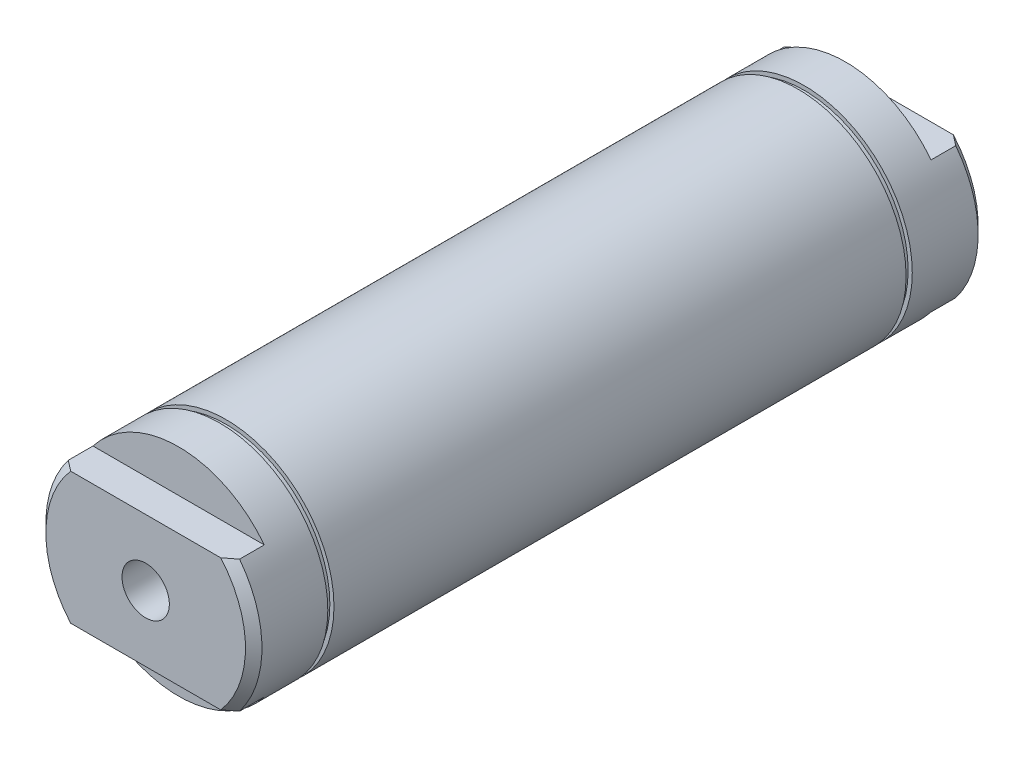
ISO-10303-21;
HEADER;
FILE_DESCRIPTION(('STEP AP214'),'2;1');
FILE_NAME('part.step','',(''),(''),'','','');
FILE_SCHEMA(('AUTOMOTIVE_DESIGN { 1 0 10303 214 1 1 1 1 }'));
ENDSEC;
DATA;
#1=APPLICATION_CONTEXT('core data for automotive mechanical design processes');
#2=APPLICATION_PROTOCOL_DEFINITION('international standard','automotive_design',2000,#1);
#3=PRODUCT_CONTEXT('',#1,'mechanical');
#4=PRODUCT('Part','Part','',(#3));
#5=PRODUCT_RELATED_PRODUCT_CATEGORY('part','',(#4));
#6=PRODUCT_DEFINITION_FORMATION('','',#4);
#7=PRODUCT_DEFINITION_CONTEXT('part definition',#1,'design');
#8=PRODUCT_DEFINITION('design','',#6,#7);
#9=PRODUCT_DEFINITION_SHAPE('','',#8);
#10=(LENGTH_UNIT() NAMED_UNIT(*) SI_UNIT(.MILLI.,.METRE.));
#11=(NAMED_UNIT(*) PLANE_ANGLE_UNIT() SI_UNIT($,.RADIAN.));
#12=(NAMED_UNIT(*) SI_UNIT($,.STERADIAN.) SOLID_ANGLE_UNIT());
#13=UNCERTAINTY_MEASURE_WITH_UNIT(LENGTH_MEASURE(1.E-05),#10,'distance_accuracy_value','');
#14=(GEOMETRIC_REPRESENTATION_CONTEXT(3) GLOBAL_UNCERTAINTY_ASSIGNED_CONTEXT((#13)) GLOBAL_UNIT_ASSIGNED_CONTEXT((#10,
#11,#12)) REPRESENTATION_CONTEXT('',''));
#15=CARTESIAN_POINT('',(0.,0.,0.));
#16=DIRECTION('',(0.,0.,1.));
#17=DIRECTION('',(1.,0.,0.));
#18=AXIS2_PLACEMENT_3D('',#15,#16,#17);
#19=CARTESIAN_POINT('',(0.,0.,89.));
#20=DIRECTION('',(0.,0.,-1.));
#21=DIRECTION('',(-1.,0.,0.));
#22=AXIS2_PLACEMENT_3D('',#19,#20,#21);
#23=CYLINDRICAL_SURFACE('',#22,26.25);
#24=CARTESIAN_POINT('',(0.,0.,69.5));
#25=DIRECTION('',(0.,0.,1.));
#26=DIRECTION('',(1.,0.,0.));
#27=AXIS2_PLACEMENT_3D('',#24,#25,#26);
#28=CIRCLE('',#27,26.25);
#29=CARTESIAN_POINT('',(26.25,0.,69.5));
#30=VERTEX_POINT('',#29);
#31=EDGE_CURVE('E464',#30,#30,#28,.T.);
#32=ORIENTED_EDGE('',*,*,#31,.F.);
#33=EDGE_LOOP('',(#32));
#34=FACE_BOUND('',#33,.T.);
#35=CARTESIAN_POINT('',(0.,0.,-69.5));
#36=DIRECTION('',(0.,0.,1.));
#37=DIRECTION('',(1.,0.,0.));
#38=AXIS2_PLACEMENT_3D('',#35,#36,#37);
#39=CIRCLE('',#38,26.25);
#40=CARTESIAN_POINT('',(26.25,0.,-69.5));
#41=VERTEX_POINT('',#40);
#42=EDGE_CURVE('E166',#41,#41,#39,.T.);
#43=ORIENTED_EDGE('',*,*,#42,.T.);
#44=EDGE_LOOP('',(#43));
#45=FACE_BOUND('',#44,.T.);
#46=ADVANCED_FACE('F51',(#34,#45),#23,.T.);
#47=CARTESIAN_POINT('',(26.25,0.,-69.5));
#48=DIRECTION('',(0.,0.,1.));
#49=DIRECTION('',(1.,0.,0.));
#50=AXIS2_PLACEMENT_3D('',#47,#48,#49);
#51=PLANE('',#50);
#52=ORIENTED_EDGE('',*,*,#42,.F.);
#53=EDGE_LOOP('',(#52));
#54=FACE_BOUND('',#53,.T.);
#55=CARTESIAN_POINT('',(0.,0.,-69.5));
#56=DIRECTION('',(0.,0.,1.));
#57=DIRECTION('',(1.,0.,0.));
#58=AXIS2_PLACEMENT_3D('',#55,#56,#57);
#59=CIRCLE('',#58,25.25);
#60=CARTESIAN_POINT('',(25.25,0.,-69.5));
#61=VERTEX_POINT('',#60);
#62=EDGE_CURVE('E473',#61,#61,#59,.T.);
#63=ORIENTED_EDGE('',*,*,#62,.T.);
#64=EDGE_LOOP('',(#63));
#65=FACE_BOUND('',#64,.T.);
#66=ADVANCED_FACE('F344',(#54,#65),#51,.F.);
#67=CARTESIAN_POINT('',(0.,0.,89.));
#68=DIRECTION('',(0.,0.,1.));
#69=DIRECTION('',(1.,0.,0.));
#70=AXIS2_PLACEMENT_3D('',#67,#68,#69);
#71=CYLINDRICAL_SURFACE('',#70,25.25);
#72=ORIENTED_EDGE('',*,*,#62,.F.);
#73=EDGE_LOOP('',(#72));
#74=FACE_BOUND('',#73,.T.);
#75=CARTESIAN_POINT('',(0.,0.,-71.));
#76=DIRECTION('',(0.,0.,1.));
#77=DIRECTION('',(1.,0.,0.));
#78=AXIS2_PLACEMENT_3D('',#75,#76,#77);
#79=CIRCLE('',#78,25.25);
#80=CARTESIAN_POINT('',(25.25,0.,-71.));
#81=VERTEX_POINT('',#80);
#82=EDGE_CURVE('E470',#81,#81,#79,.T.);
#83=ORIENTED_EDGE('',*,*,#82,.T.);
#84=EDGE_LOOP('',(#83));
#85=FACE_BOUND('',#84,.T.);
#86=ADVANCED_FACE('F350',(#74,#85),#71,.T.);
#87=CARTESIAN_POINT('',(26.25,0.,-71.));
#88=DIRECTION('',(0.,0.,-1.));
#89=DIRECTION('',(-1.,0.,0.));
#90=AXIS2_PLACEMENT_3D('',#87,#88,#89);
#91=PLANE('',#90);
#92=ORIENTED_EDGE('',*,*,#82,.F.);
#93=EDGE_LOOP('',(#92));
#94=FACE_BOUND('',#93,.T.);
#95=CARTESIAN_POINT('',(0.,0.,-71.));
#96=DIRECTION('',(0.,0.,1.));
#97=DIRECTION('',(1.,0.,0.));
#98=AXIS2_PLACEMENT_3D('',#95,#96,#97);
#99=CIRCLE('',#98,26.25);
#100=CARTESIAN_POINT('',(26.25,0.,-71.));
#101=VERTEX_POINT('',#100);
#102=EDGE_CURVE('E467',#101,#101,#99,.T.);
#103=ORIENTED_EDGE('',*,*,#102,.T.);
#104=EDGE_LOOP('',(#103));
#105=FACE_BOUND('',#104,.T.);
#106=ADVANCED_FACE('F154',(#94,#105),#91,.F.);
#107=CARTESIAN_POINT('',(0.,0.,-79.));
#108=DIRECTION('',(0.,0.,-1.));
#109=DIRECTION('',(-1.,0.,0.));
#110=AXIS2_PLACEMENT_3D('',#107,#108,#109);
#111=CONICAL_SURFACE('',#110,5.75437,1.02974425867665);
#112=CARTESIAN_POINT('',(0.,0.,-75.5424256796864));
#113=VERTEX_POINT('',#112);
#114=VERTEX_LOOP('',#113);
#115=FACE_BOUND('',#114,.T.);
#116=CARTESIAN_POINT('',(0.,0.,-79.));
#117=DIRECTION('',(0.,0.,-1.));
#118=DIRECTION('',(-1.,0.,0.));
#119=AXIS2_PLACEMENT_3D('',#116,#117,#118);
#120=CIRCLE('',#119,5.75437);
#121=CARTESIAN_POINT('',(-5.75437,0.,-79.));
#122=VERTEX_POINT('',#121);
#123=EDGE_CURVE('E158',#122,#122,#120,.T.);
#124=ORIENTED_EDGE('',*,*,#123,.T.);
#125=EDGE_LOOP('',(#124));
#126=FACE_BOUND('',#125,.T.);
#127=ADVANCED_FACE('F150',(#115,#126),#111,.F.);
#128=CARTESIAN_POINT('',(0.,0.,-89.));
#129=DIRECTION('',(0.,0.,-1.));
#130=DIRECTION('',(-1.,0.,0.));
#131=AXIS2_PLACEMENT_3D('',#128,#129,#130);
#132=CYLINDRICAL_SURFACE('',#131,5.75436999999999);
#133=ORIENTED_EDGE('',*,*,#123,.F.);
#134=EDGE_LOOP('',(#133));
#135=FACE_BOUND('',#134,.T.);
#136=CARTESIAN_POINT('',(0.,0.,-89.));
#137=DIRECTION('',(0.,0.,-1.));
#138=DIRECTION('',(-1.,0.,0.));
#139=AXIS2_PLACEMENT_3D('',#136,#137,#138);
#140=CIRCLE('',#139,5.75436999999999);
#141=CARTESIAN_POINT('',(-5.75436999999999,0.,-89.));
#142=VERTEX_POINT('',#141);
#143=EDGE_CURVE('E161',#142,#142,#140,.T.);
#144=ORIENTED_EDGE('',*,*,#143,.T.);
#145=EDGE_LOOP('',(#144));
#146=FACE_BOUND('',#145,.T.);
#147=ADVANCED_FACE('F153',(#135,#146),#132,.F.);
#148=CARTESIAN_POINT('',(0.,0.,-81.));
#149=DIRECTION('',(0.,0.,-1.));
#150=DIRECTION('',(1.,0.,0.));
#151=AXIS2_PLACEMENT_3D('',#148,#149,#150);
#152=PLANE('',#151);
#153=CARTESIAN_POINT('',(0.,0.,-81.));
#154=DIRECTION('',(0.,0.,1.));
#155=DIRECTION('',(1.,0.,0.));
#156=AXIS2_PLACEMENT_3D('',#153,#154,#155);
#157=CIRCLE('',#156,26.25);
#158=CARTESIAN_POINT('',(-20.8101537716568,-16.,-81.));
#159=VERTEX_POINT('',#158);
#160=CARTESIAN_POINT('',(20.8101537716568,-16.,-81.));
#161=VERTEX_POINT('',#160);
#162=EDGE_CURVE('E163',#159,#161,#157,.T.);
#163=ORIENTED_EDGE('',*,*,#162,.F.);
#164=DIRECTION('',(-1.,0.,0.));
#165=VECTOR('',#164,1.);
#166=CARTESIAN_POINT('',(20.8101537716568,-16.,-81.));
#167=LINE('',#166,#165);
#168=EDGE_CURVE('E186',#161,#159,#167,.T.);
#169=ORIENTED_EDGE('',*,*,#168,.F.);
#170=EDGE_LOOP('',(#163,#169));
#171=FACE_BOUND('',#170,.T.);
#172=ADVANCED_FACE('F327',(#171),#152,.T.);
#173=CARTESIAN_POINT('',(20.8101537716568,-16.,-81.));
#174=DIRECTION('',(0.,-1.,0.));
#175=DIRECTION('',(0.,0.,-1.));
#176=AXIS2_PLACEMENT_3D('',#173,#174,#175);
#177=PLANE('',#176);
#178=DIRECTION('',(0.,0.,-1.));
#179=VECTOR('',#178,1.);
#180=CARTESIAN_POINT('',(-20.8101537716568,-16.,-81.));
#181=LINE('',#180,#179);
#182=CARTESIAN_POINT('',(-20.8101537716568,-16.,-87.));
#183=VERTEX_POINT('',#182);
#184=EDGE_CURVE('E187',#159,#183,#181,.T.);
#185=ORIENTED_EDGE('',*,*,#184,.T.);
#186=CARTESIAN_POINT('',(-20.8101537716568,-16.,-87.));
#187=CARTESIAN_POINT('',(-20.5965788943011,-16.,-87.1693129712668));
#188=CARTESIAN_POINT('',(-20.382534274038,-16.,-87.3380345634438));
#189=CARTESIAN_POINT('',(-19.9534476279904,-16.,-87.6741859546091));
#190=CARTESIAN_POINT('',(-19.7384056441946,-16.,-87.841615807203));
#191=CARTESIAN_POINT('',(-19.3072474935535,-16.,-88.1750896395162));
#192=CARTESIAN_POINT('',(-19.091131321499,-16.,-88.3411336125043));
#193=CARTESIAN_POINT('',(-18.657741488002,-16.,-88.6717226189774));
#194=CARTESIAN_POINT('',(-18.440467778629,-16.,-88.836267589616));
#195=CARTESIAN_POINT('',(-18.2225821441419,-16.,-89.));
#196=B_SPLINE_CURVE_WITH_KNOTS('',3,(#186,#187,#188,#189,#190,#191,#192,#193,#194,#195),
.UNSPECIFIED.,.F.,.F.,(4,2,2,2,4),(0.,0.817636826733301,1.6352395381552,2.45284621838857,
3.27048702084017),.UNSPECIFIED.);
#197=CARTESIAN_POINT('',(-18.2225821441419,-16.,-89.));
#198=VERTEX_POINT('',#197);
#199=EDGE_CURVE('E317',#183,#198,#196,.T.);
#200=ORIENTED_EDGE('',*,*,#199,.T.);
#201=DIRECTION('',(-1.,0.,0.));
#202=VECTOR('',#201,1.);
#203=CARTESIAN_POINT('',(20.8101537716568,-16.,-89.));
#204=LINE('',#203,#202);
#205=CARTESIAN_POINT('',(18.2225821441419,-16.,-89.));
#206=VERTEX_POINT('',#205);
#207=EDGE_CURVE('E160',#206,#198,#204,.T.);
#208=ORIENTED_EDGE('',*,*,#207,.F.);
#209=CARTESIAN_POINT('',(18.2225821441419,-16.,-89.));
#210=CARTESIAN_POINT('',(18.440467778629,-16.,-88.836267589616));
#211=CARTESIAN_POINT('',(18.657741488002,-16.,-88.6717226189774));
#212=CARTESIAN_POINT('',(19.091131321499,-16.,-88.3411336125043));
#213=CARTESIAN_POINT('',(19.3072474935535,-16.,-88.1750896395162));
#214=CARTESIAN_POINT('',(19.7384056441946,-16.,-87.841615807203));
#215=CARTESIAN_POINT('',(19.9534476279904,-16.,-87.6741859546091));
#216=CARTESIAN_POINT('',(20.382534274038,-16.,-87.3380345634438));
#217=CARTESIAN_POINT('',(20.5965788943011,-16.,-87.1693129712668));
#218=CARTESIAN_POINT('',(20.8101537716568,-16.,-87.));
#219=B_SPLINE_CURVE_WITH_KNOTS('',3,(#209,#210,#211,#212,#213,#214,#215,#216,#217,#218),
.UNSPECIFIED.,.F.,.F.,(4,2,2,2,4),(0.,0.817640802451616,1.63524748268497,2.45285019410687,
3.27048702084017),.UNSPECIFIED.);
#220=CARTESIAN_POINT('',(20.8101537716568,-16.,-87.));
#221=VERTEX_POINT('',#220);
#222=EDGE_CURVE('E310',#206,#221,#219,.T.);
#223=ORIENTED_EDGE('',*,*,#222,.T.);
#224=DIRECTION('',(0.,0.,-1.));
#225=VECTOR('',#224,1.);
#226=CARTESIAN_POINT('',(20.8101537716568,-16.,-81.));
#227=LINE('',#226,#225);
#228=EDGE_CURVE('E178',#161,#221,#227,.T.);
#229=ORIENTED_EDGE('',*,*,#228,.F.);
#230=ORIENTED_EDGE('',*,*,#168,.T.);
#231=EDGE_LOOP('',(#185,#200,#208,#223,#229,#230));
#232=FACE_BOUND('',#231,.T.);
#233=ADVANCED_FACE('F275',(#232),#177,.T.);
#234=CARTESIAN_POINT('',(0.,0.,-89.));
#235=DIRECTION('',(0.,0.,1.));
#236=DIRECTION('',(1.,0.,0.));
#237=AXIS2_PLACEMENT_3D('',#234,#235,#236);
#238=PLANE('',#237);
#239=ORIENTED_EDGE('',*,*,#143,.F.);
#240=EDGE_LOOP('',(#239));
#241=FACE_BOUND('',#240,.T.);
#242=ORIENTED_EDGE('',*,*,#207,.T.);
#243=CARTESIAN_POINT('',(0.,0.,-89.));
#244=DIRECTION('',(0.,0.,1.));
#245=DIRECTION('',(1.,0.,0.));
#246=AXIS2_PLACEMENT_3D('',#243,#244,#245);
#247=CIRCLE('',#246,24.25);
#248=CARTESIAN_POINT('',(-18.2225821441419,16.,-89.));
#249=VERTEX_POINT('',#248);
#250=EDGE_CURVE('E79',#198,#249,#247,.F.);
#251=ORIENTED_EDGE('',*,*,#250,.T.);
#252=DIRECTION('',(1.,0.,0.));
#253=VECTOR('',#252,1.);
#254=CARTESIAN_POINT('',(-20.8101537716568,16.,-89.));
#255=LINE('',#254,#253);
#256=CARTESIAN_POINT('',(18.2225821441419,16.,-89.));
#257=VERTEX_POINT('',#256);
#258=EDGE_CURVE('E174',#249,#257,#255,.T.);
#259=ORIENTED_EDGE('',*,*,#258,.T.);
#260=CARTESIAN_POINT('',(0.,0.,-89.));
#261=DIRECTION('',(0.,0.,1.));
#262=DIRECTION('',(1.,0.,0.));
#263=AXIS2_PLACEMENT_3D('',#260,#261,#262);
#264=CIRCLE('',#263,24.25);
#265=EDGE_CURVE('E422',#257,#206,#264,.F.);
#266=ORIENTED_EDGE('',*,*,#265,.T.);
#267=EDGE_LOOP('',(#242,#251,#259,#266));
#268=FACE_BOUND('',#267,.T.);
#269=ADVANCED_FACE('F271',(#241,#268),#238,.F.);
#270=CARTESIAN_POINT('',(0.,0.,-81.));
#271=DIRECTION('',(0.,0.,-1.));
#272=DIRECTION('',(1.,0.,0.));
#273=AXIS2_PLACEMENT_3D('',#270,#271,#272);
#274=PLANE('',#273);
#275=CARTESIAN_POINT('',(0.,0.,-81.));
#276=DIRECTION('',(0.,0.,1.));
#277=DIRECTION('',(1.,0.,0.));
#278=AXIS2_PLACEMENT_3D('',#275,#276,#277);
#279=CIRCLE('',#278,26.25);
#280=CARTESIAN_POINT('',(20.8101537716568,16.,-81.));
#281=VERTEX_POINT('',#280);
#282=CARTESIAN_POINT('',(-20.8101537716568,16.,-81.));
#283=VERTEX_POINT('',#282);
#284=EDGE_CURVE('E170',#281,#283,#279,.T.);
#285=ORIENTED_EDGE('',*,*,#284,.F.);
#286=DIRECTION('',(1.,0.,0.));
#287=VECTOR('',#286,1.);
#288=CARTESIAN_POINT('',(-20.8101537716568,16.,-81.));
#289=LINE('',#288,#287);
#290=EDGE_CURVE('E173',#283,#281,#289,.T.);
#291=ORIENTED_EDGE('',*,*,#290,.F.);
#292=EDGE_LOOP('',(#285,#291));
#293=FACE_BOUND('',#292,.T.);
#294=ADVANCED_FACE('F274',(#293),#274,.T.);
#295=CARTESIAN_POINT('',(-20.8101537716568,16.,-81.));
#296=DIRECTION('',(0.,1.,0.));
#297=DIRECTION('',(0.,0.,1.));
#298=AXIS2_PLACEMENT_3D('',#295,#296,#297);
#299=PLANE('',#298);
#300=ORIENTED_EDGE('',*,*,#258,.F.);
#301=CARTESIAN_POINT('',(-18.2225821441419,16.,-89.));
#302=CARTESIAN_POINT('',(-18.440467778629,16.,-88.836267589616));
#303=CARTESIAN_POINT('',(-18.657741488002,16.,-88.6717226189774));
#304=CARTESIAN_POINT('',(-19.091131321499,16.,-88.3411336125043));
#305=CARTESIAN_POINT('',(-19.3072474935535,16.,-88.1750896395162));
#306=CARTESIAN_POINT('',(-19.7384056441946,16.,-87.841615807203));
#307=CARTESIAN_POINT('',(-19.9534476279904,16.,-87.6741859546091));
#308=CARTESIAN_POINT('',(-20.382534274038,16.,-87.3380345634438));
#309=CARTESIAN_POINT('',(-20.5965788943011,16.,-87.1693129712668));
#310=CARTESIAN_POINT('',(-20.8101537716568,16.,-87.));
#311=B_SPLINE_CURVE_WITH_KNOTS('',3,(#301,#302,#303,#304,#305,#306,#307,#308,#309,#310),
.UNSPECIFIED.,.F.,.F.,(4,2,2,2,4),(0.,0.817640802451616,1.63524748268497,2.45285019410687,
3.27048702084017),.UNSPECIFIED.);
#312=CARTESIAN_POINT('',(-20.8101537716568,16.,-87.));
#313=VERTEX_POINT('',#312);
#314=EDGE_CURVE('E11',#249,#313,#311,.T.);
#315=ORIENTED_EDGE('',*,*,#314,.T.);
#316=DIRECTION('',(0.,0.,-1.));
#317=VECTOR('',#316,1.);
#318=CARTESIAN_POINT('',(-20.8101537716568,16.,-81.));
#319=LINE('',#318,#317);
#320=EDGE_CURVE('E179',#283,#313,#319,.T.);
#321=ORIENTED_EDGE('',*,*,#320,.F.);
#322=ORIENTED_EDGE('',*,*,#290,.T.);
#323=DIRECTION('',(0.,0.,-1.));
#324=VECTOR('',#323,1.);
#325=CARTESIAN_POINT('',(20.8101537716568,16.,-81.));
#326=LINE('',#325,#324);
#327=CARTESIAN_POINT('',(20.8101537716568,16.,-87.));
#328=VERTEX_POINT('',#327);
#329=EDGE_CURVE('E176',#281,#328,#326,.T.);
#330=ORIENTED_EDGE('',*,*,#329,.T.);
#331=CARTESIAN_POINT('',(20.8101537716568,16.,-87.));
#332=CARTESIAN_POINT('',(20.5965788943011,16.,-87.1693129712668));
#333=CARTESIAN_POINT('',(20.382534274038,16.,-87.3380345634438));
#334=CARTESIAN_POINT('',(19.9534476279904,16.,-87.6741859546091));
#335=CARTESIAN_POINT('',(19.7384056441946,16.,-87.841615807203));
#336=CARTESIAN_POINT('',(19.3072474935535,16.,-88.1750896395162));
#337=CARTESIAN_POINT('',(19.091131321499,16.,-88.3411336125043));
#338=CARTESIAN_POINT('',(18.657741488002,16.,-88.6717226189774));
#339=CARTESIAN_POINT('',(18.440467778629,16.,-88.836267589616));
#340=CARTESIAN_POINT('',(18.2225821441419,16.,-89.));
#341=B_SPLINE_CURVE_WITH_KNOTS('',3,(#331,#332,#333,#334,#335,#336,#337,#338,#339,#340),
.UNSPECIFIED.,.F.,.F.,(4,2,2,2,4),(0.,0.817636826733301,1.6352395381552,2.45284621838857,
3.27048702084017),.UNSPECIFIED.);
#342=EDGE_CURVE('E66',#328,#257,#341,.T.);
#343=ORIENTED_EDGE('',*,*,#342,.T.);
#344=EDGE_LOOP('',(#300,#315,#321,#322,#330,#343));
#345=FACE_BOUND('',#344,.T.);
#346=ADVANCED_FACE('F280',(#345),#299,.T.);
#347=ORIENTED_EDGE('',*,*,#102,.F.);
#348=EDGE_LOOP('',(#347));
#349=FACE_BOUND('',#348,.T.);
#350=ORIENTED_EDGE('',*,*,#320,.T.);
#351=CARTESIAN_POINT('',(0.,0.,-87.));
#352=DIRECTION('',(0.,0.,1.));
#353=DIRECTION('',(1.,0.,0.));
#354=AXIS2_PLACEMENT_3D('',#351,#352,#353);
#355=CIRCLE('',#354,26.25);
#356=EDGE_CURVE('E307',#313,#183,#355,.T.);
#357=ORIENTED_EDGE('',*,*,#356,.T.);
#358=ORIENTED_EDGE('',*,*,#184,.F.);
#359=ORIENTED_EDGE('',*,*,#162,.T.);
#360=ORIENTED_EDGE('',*,*,#228,.T.);
#361=CARTESIAN_POINT('',(0.,0.,-87.));
#362=DIRECTION('',(0.,0.,1.));
#363=DIRECTION('',(1.,0.,0.));
#364=AXIS2_PLACEMENT_3D('',#361,#362,#363);
#365=CIRCLE('',#364,26.25);
#366=EDGE_CURVE('E298',#221,#328,#365,.T.);
#367=ORIENTED_EDGE('',*,*,#366,.T.);
#368=ORIENTED_EDGE('',*,*,#329,.F.);
#369=ORIENTED_EDGE('',*,*,#284,.T.);
#370=EDGE_LOOP('',(#350,#357,#358,#359,#360,#367,#368,#369));
#371=FACE_BOUND('',#370,.T.);
#372=ADVANCED_FACE('F277',(#349,#371),#23,.T.);
#373=CARTESIAN_POINT('',(26.25,0.,69.5));
#374=DIRECTION('',(0.,0.,-1.));
#375=DIRECTION('',(1.,0.,0.));
#376=AXIS2_PLACEMENT_3D('',#373,#374,#375);
#377=PLANE('',#376);
#378=ORIENTED_EDGE('',*,*,#31,.T.);
#379=EDGE_LOOP('',(#378));
#380=FACE_BOUND('',#379,.T.);
#381=CARTESIAN_POINT('',(0.,0.,69.5));
#382=DIRECTION('',(0.,0.,1.));
#383=DIRECTION('',(1.,0.,0.));
#384=AXIS2_PLACEMENT_3D('',#381,#382,#383);
#385=CIRCLE('',#384,25.25);
#386=CARTESIAN_POINT('',(25.25,0.,69.5));
#387=VERTEX_POINT('',#386);
#388=EDGE_CURVE('E459',#387,#387,#385,.T.);
#389=ORIENTED_EDGE('',*,*,#388,.F.);
#390=EDGE_LOOP('',(#389));
#391=FACE_BOUND('',#390,.T.);
#392=ADVANCED_FACE('F279',(#380,#391),#377,.F.);
#393=CARTESIAN_POINT('',(0.,0.,-89.));
#394=DIRECTION('',(0.,0.,-1.));
#395=DIRECTION('',(1.,0.,0.));
#396=AXIS2_PLACEMENT_3D('',#393,#394,#395);
#397=CYLINDRICAL_SURFACE('',#396,25.25);
#398=ORIENTED_EDGE('',*,*,#388,.T.);
#399=EDGE_LOOP('',(#398));
#400=FACE_BOUND('',#399,.T.);
#401=CARTESIAN_POINT('',(0.,0.,71.));
#402=DIRECTION('',(0.,0.,1.));
#403=DIRECTION('',(1.,0.,0.));
#404=AXIS2_PLACEMENT_3D('',#401,#402,#403);
#405=CIRCLE('',#404,25.25);
#406=CARTESIAN_POINT('',(25.25,0.,71.));
#407=VERTEX_POINT('',#406);
#408=EDGE_CURVE('E457',#407,#407,#405,.T.);
#409=ORIENTED_EDGE('',*,*,#408,.F.);
#410=EDGE_LOOP('',(#409));
#411=FACE_BOUND('',#410,.T.);
#412=ADVANCED_FACE('F445',(#400,#411),#397,.T.);
#413=CARTESIAN_POINT('',(26.25,0.,71.));
#414=DIRECTION('',(0.,0.,1.));
#415=DIRECTION('',(-1.,0.,0.));
#416=AXIS2_PLACEMENT_3D('',#413,#414,#415);
#417=PLANE('',#416);
#418=ORIENTED_EDGE('',*,*,#408,.T.);
#419=EDGE_LOOP('',(#418));
#420=FACE_BOUND('',#419,.T.);
#421=CARTESIAN_POINT('',(0.,0.,71.));
#422=DIRECTION('',(0.,0.,1.));
#423=DIRECTION('',(1.,0.,0.));
#424=AXIS2_PLACEMENT_3D('',#421,#422,#423);
#425=CIRCLE('',#424,26.25);
#426=CARTESIAN_POINT('',(26.25,0.,71.));
#427=VERTEX_POINT('',#426);
#428=EDGE_CURVE('E362',#427,#427,#425,.T.);
#429=ORIENTED_EDGE('',*,*,#428,.F.);
#430=EDGE_LOOP('',(#429));
#431=FACE_BOUND('',#430,.T.);
#432=ADVANCED_FACE('F335',(#420,#431),#417,.F.);
#433=CARTESIAN_POINT('',(0.,0.,79.));
#434=DIRECTION('',(0.,0.,1.));
#435=DIRECTION('',(1.,0.,0.));
#436=AXIS2_PLACEMENT_3D('',#433,#434,#435);
#437=CONICAL_SURFACE('',#436,5.75437,1.02974425867665);
#438=CARTESIAN_POINT('',(0.,0.,75.5424256796864));
#439=VERTEX_POINT('',#438);
#440=VERTEX_LOOP('',#439);
#441=FACE_BOUND('',#440,.T.);
#442=CARTESIAN_POINT('',(0.,0.,79.));
#443=DIRECTION('',(0.,0.,1.));
#444=DIRECTION('',(1.,0.,0.));
#445=AXIS2_PLACEMENT_3D('',#442,#443,#444);
#446=CIRCLE('',#445,5.75437);
#447=CARTESIAN_POINT('',(5.75437,0.,79.));
#448=VERTEX_POINT('',#447);
#449=EDGE_CURVE('E195',#448,#448,#446,.T.);
#450=ORIENTED_EDGE('',*,*,#449,.T.);
#451=EDGE_LOOP('',(#450));
#452=FACE_BOUND('',#451,.T.);
#453=ADVANCED_FACE('F332',(#441,#452),#437,.F.);
#454=CARTESIAN_POINT('',(0.,0.,89.));
#455=DIRECTION('',(0.,0.,1.));
#456=DIRECTION('',(1.,0.,0.));
#457=AXIS2_PLACEMENT_3D('',#454,#455,#456);
#458=CYLINDRICAL_SURFACE('',#457,5.75436999999999);
#459=ORIENTED_EDGE('',*,*,#449,.F.);
#460=EDGE_LOOP('',(#459));
#461=FACE_BOUND('',#460,.T.);
#462=CARTESIAN_POINT('',(0.,0.,89.));
#463=DIRECTION('',(0.,0.,1.));
#464=DIRECTION('',(1.,0.,0.));
#465=AXIS2_PLACEMENT_3D('',#462,#463,#464);
#466=CIRCLE('',#465,5.75436999999999);
#467=CARTESIAN_POINT('',(5.75436999999999,0.,89.));
#468=VERTEX_POINT('',#467);
#469=EDGE_CURVE('E182',#468,#468,#466,.T.);
#470=ORIENTED_EDGE('',*,*,#469,.T.);
#471=EDGE_LOOP('',(#470));
#472=FACE_BOUND('',#471,.T.);
#473=ADVANCED_FACE('F264',(#461,#472),#458,.F.);
#474=CARTESIAN_POINT('',(0.,0.,81.));
#475=DIRECTION('',(0.,0.,1.));
#476=DIRECTION('',(1.,0.,0.));
#477=AXIS2_PLACEMENT_3D('',#474,#475,#476);
#478=PLANE('',#477);
#479=CARTESIAN_POINT('',(0.,0.,81.));
#480=DIRECTION('',(0.,0.,1.));
#481=DIRECTION('',(1.,0.,0.));
#482=AXIS2_PLACEMENT_3D('',#479,#480,#481);
#483=CIRCLE('',#482,26.25);
#484=CARTESIAN_POINT('',(-20.8101537716568,-16.,81.));
#485=VERTEX_POINT('',#484);
#486=CARTESIAN_POINT('',(20.8101537716568,-16.,81.));
#487=VERTEX_POINT('',#486);
#488=EDGE_CURVE('E223',#485,#487,#483,.T.);
#489=ORIENTED_EDGE('',*,*,#488,.T.);
#490=DIRECTION('',(-1.,0.,0.));
#491=VECTOR('',#490,1.);
#492=CARTESIAN_POINT('',(20.8101537716568,-16.,81.));
#493=LINE('',#492,#491);
#494=EDGE_CURVE('E218',#487,#485,#493,.T.);
#495=ORIENTED_EDGE('',*,*,#494,.T.);
#496=EDGE_LOOP('',(#489,#495));
#497=FACE_BOUND('',#496,.T.);
#498=ADVANCED_FACE('F256',(#497),#478,.T.);
#499=CARTESIAN_POINT('',(20.8101537716568,-16.,81.));
#500=DIRECTION('',(0.,1.,0.));
#501=DIRECTION('',(0.,0.,1.));
#502=AXIS2_PLACEMENT_3D('',#499,#500,#501);
#503=PLANE('',#502);
#504=DIRECTION('',(-1.,0.,0.));
#505=VECTOR('',#504,1.);
#506=CARTESIAN_POINT('',(20.8101537716568,-16.,89.));
#507=LINE('',#506,#505);
#508=CARTESIAN_POINT('',(18.2225821441419,-16.,89.));
#509=VERTEX_POINT('',#508);
#510=CARTESIAN_POINT('',(-18.2225821441419,-16.,89.));
#511=VERTEX_POINT('',#510);
#512=EDGE_CURVE('E208',#509,#511,#507,.T.);
#513=ORIENTED_EDGE('',*,*,#512,.T.);
#514=CARTESIAN_POINT('',(-18.2225821441419,-16.,89.));
#515=CARTESIAN_POINT('',(-18.440467778629,-16.,88.836267589616));
#516=CARTESIAN_POINT('',(-18.657741488002,-16.,88.6717226189774));
#517=CARTESIAN_POINT('',(-19.091131321499,-16.,88.3411336125043));
#518=CARTESIAN_POINT('',(-19.3072474935535,-16.,88.1750896395162));
#519=CARTESIAN_POINT('',(-19.7384056441946,-16.,87.841615807203));
#520=CARTESIAN_POINT('',(-19.9534476279904,-16.,87.6741859546091));
#521=CARTESIAN_POINT('',(-20.382534274038,-16.,87.3380345634438));
#522=CARTESIAN_POINT('',(-20.5965788943011,-16.,87.1693129712668));
#523=CARTESIAN_POINT('',(-20.8101537716568,-16.,87.));
#524=B_SPLINE_CURVE_WITH_KNOTS('',3,(#514,#515,#516,#517,#518,#519,#520,#521,#522,#523),
.UNSPECIFIED.,.F.,.F.,(4,2,2,2,4),(0.,0.817640802451613,1.63524748268497,2.45285019410688,
3.27048702084017),.UNSPECIFIED.);
#525=CARTESIAN_POINT('',(-20.8101537716568,-16.,87.));
#526=VERTEX_POINT('',#525);
#527=EDGE_CURVE('E240',#511,#526,#524,.T.);
#528=ORIENTED_EDGE('',*,*,#527,.T.);
#529=DIRECTION('',(0.,0.,1.));
#530=VECTOR('',#529,1.);
#531=CARTESIAN_POINT('',(-20.8101537716568,-16.,81.));
#532=LINE('',#531,#530);
#533=EDGE_CURVE('E198',#485,#526,#532,.T.);
#534=ORIENTED_EDGE('',*,*,#533,.F.);
#535=ORIENTED_EDGE('',*,*,#494,.F.);
#536=DIRECTION('',(0.,0.,1.));
#537=VECTOR('',#536,1.);
#538=CARTESIAN_POINT('',(20.8101537716568,-16.,81.));
#539=LINE('',#538,#537);
#540=CARTESIAN_POINT('',(20.8101537716568,-16.,87.));
#541=VERTEX_POINT('',#540);
#542=EDGE_CURVE('E215',#487,#541,#539,.T.);
#543=ORIENTED_EDGE('',*,*,#542,.T.);
#544=CARTESIAN_POINT('',(20.8101537716568,-16.,87.));
#545=CARTESIAN_POINT('',(20.5965788943011,-16.,87.1693129712668));
#546=CARTESIAN_POINT('',(20.382534274038,-16.,87.3380345634438));
#547=CARTESIAN_POINT('',(19.9534476279904,-16.,87.6741859546091));
#548=CARTESIAN_POINT('',(19.7384056441946,-16.,87.841615807203));
#549=CARTESIAN_POINT('',(19.3072474935535,-16.,88.1750896395162));
#550=CARTESIAN_POINT('',(19.091131321499,-16.,88.3411336125043));
#551=CARTESIAN_POINT('',(18.657741488002,-16.,88.6717226189774));
#552=CARTESIAN_POINT('',(18.4404677786291,-16.,88.836267589616));
#553=CARTESIAN_POINT('',(18.2225821441419,-16.,89.));
#554=B_SPLINE_CURVE_WITH_KNOTS('',3,(#544,#545,#546,#547,#548,#549,#550,#551,#552,#553),
.UNSPECIFIED.,.F.,.F.,(4,2,2,2,4),(0.,0.81763682673331,1.6352395381552,2.45284621838857,
3.27048702084017),.UNSPECIFIED.);
#555=EDGE_CURVE('E232',#541,#509,#554,.T.);
#556=ORIENTED_EDGE('',*,*,#555,.T.);
#557=EDGE_LOOP('',(#513,#528,#534,#535,#543,#556));
#558=FACE_BOUND('',#557,.T.);
#559=ADVANCED_FACE('F250',(#558),#503,.F.);
#560=CARTESIAN_POINT('',(0.,0.,81.));
#561=DIRECTION('',(0.,0.,1.));
#562=DIRECTION('',(1.,0.,0.));
#563=AXIS2_PLACEMENT_3D('',#560,#561,#562);
#564=PLANE('',#563);
#565=CARTESIAN_POINT('',(0.,0.,81.));
#566=DIRECTION('',(0.,0.,1.));
#567=DIRECTION('',(1.,0.,0.));
#568=AXIS2_PLACEMENT_3D('',#565,#566,#567);
#569=CIRCLE('',#568,26.25);
#570=CARTESIAN_POINT('',(20.8101537716568,16.,81.));
#571=VERTEX_POINT('',#570);
#572=CARTESIAN_POINT('',(-20.8101537716568,16.,81.));
#573=VERTEX_POINT('',#572);
#574=EDGE_CURVE('E199',#571,#573,#569,.T.);
#575=ORIENTED_EDGE('',*,*,#574,.T.);
#576=DIRECTION('',(1.,0.,0.));
#577=VECTOR('',#576,1.);
#578=CARTESIAN_POINT('',(-20.8101537716568,16.,81.));
#579=LINE('',#578,#577);
#580=EDGE_CURVE('E201',#573,#571,#579,.T.);
#581=ORIENTED_EDGE('',*,*,#580,.T.);
#582=EDGE_LOOP('',(#575,#581));
#583=FACE_BOUND('',#582,.T.);
#584=ADVANCED_FACE('F255',(#583),#564,.T.);
#585=CARTESIAN_POINT('',(-20.8101537716568,16.,81.));
#586=DIRECTION('',(0.,-1.,0.));
#587=DIRECTION('',(0.,0.,-1.));
#588=AXIS2_PLACEMENT_3D('',#585,#586,#587);
#589=PLANE('',#588);
#590=DIRECTION('',(0.,0.,1.));
#591=VECTOR('',#590,1.);
#592=CARTESIAN_POINT('',(-20.8101537716568,16.,81.));
#593=LINE('',#592,#591);
#594=CARTESIAN_POINT('',(-20.8101537716568,16.,87.));
#595=VERTEX_POINT('',#594);
#596=EDGE_CURVE('E205',#573,#595,#593,.T.);
#597=ORIENTED_EDGE('',*,*,#596,.T.);
#598=CARTESIAN_POINT('',(-20.8101537716568,16.,87.));
#599=CARTESIAN_POINT('',(-20.5965788943011,16.,87.1693129712668));
#600=CARTESIAN_POINT('',(-20.382534274038,16.,87.3380345634438));
#601=CARTESIAN_POINT('',(-19.9534476279904,16.,87.6741859546091));
#602=CARTESIAN_POINT('',(-19.7384056441946,16.,87.841615807203));
#603=CARTESIAN_POINT('',(-19.3072474935535,16.,88.1750896395162));
#604=CARTESIAN_POINT('',(-19.091131321499,16.,88.3411336125043));
#605=CARTESIAN_POINT('',(-18.657741488002,16.,88.6717226189774));
#606=CARTESIAN_POINT('',(-18.4404677786291,16.,88.836267589616));
#607=CARTESIAN_POINT('',(-18.2225821441419,16.,89.));
#608=B_SPLINE_CURVE_WITH_KNOTS('',3,(#598,#599,#600,#601,#602,#603,#604,#605,#606,#607),
.UNSPECIFIED.,.F.,.F.,(4,2,2,2,4),(0.,0.81763682673331,1.6352395381552,2.45284621838857,
3.27048702084017),.UNSPECIFIED.);
#609=CARTESIAN_POINT('',(-18.2225821441419,16.,89.));
#610=VERTEX_POINT('',#609);
#611=EDGE_CURVE('E291',#595,#610,#608,.T.);
#612=ORIENTED_EDGE('',*,*,#611,.T.);
#613=DIRECTION('',(1.,0.,0.));
#614=VECTOR('',#613,1.);
#615=CARTESIAN_POINT('',(-20.8101537716568,16.,89.));
#616=LINE('',#615,#614);
#617=CARTESIAN_POINT('',(18.2225821441419,16.,89.));
#618=VERTEX_POINT('',#617);
#619=EDGE_CURVE('E202',#610,#618,#616,.T.);
#620=ORIENTED_EDGE('',*,*,#619,.T.);
#621=CARTESIAN_POINT('',(18.2225821441419,16.,89.));
#622=CARTESIAN_POINT('',(18.440467778629,16.,88.836267589616));
#623=CARTESIAN_POINT('',(18.657741488002,16.,88.6717226189774));
#624=CARTESIAN_POINT('',(19.091131321499,16.,88.3411336125043));
#625=CARTESIAN_POINT('',(19.3072474935535,16.,88.1750896395162));
#626=CARTESIAN_POINT('',(19.7384056441946,16.,87.841615807203));
#627=CARTESIAN_POINT('',(19.9534476279904,16.,87.6741859546091));
#628=CARTESIAN_POINT('',(20.382534274038,16.,87.3380345634438));
#629=CARTESIAN_POINT('',(20.5965788943011,16.,87.1693129712668));
#630=CARTESIAN_POINT('',(20.8101537716568,16.,87.));
#631=B_SPLINE_CURVE_WITH_KNOTS('',3,(#621,#622,#623,#624,#625,#626,#627,#628,#629,#630),
.UNSPECIFIED.,.F.,.F.,(4,2,2,2,4),(0.,0.817640802451613,1.63524748268497,2.45285019410688,
3.27048702084017),.UNSPECIFIED.);
#632=CARTESIAN_POINT('',(20.8101537716568,16.,87.));
#633=VERTEX_POINT('',#632);
#634=EDGE_CURVE('E299',#618,#633,#631,.T.);
#635=ORIENTED_EDGE('',*,*,#634,.T.);
#636=DIRECTION('',(0.,0.,1.));
#637=VECTOR('',#636,1.);
#638=CARTESIAN_POINT('',(20.8101537716568,16.,81.));
#639=LINE('',#638,#637);
#640=EDGE_CURVE('E209',#571,#633,#639,.T.);
#641=ORIENTED_EDGE('',*,*,#640,.F.);
#642=ORIENTED_EDGE('',*,*,#580,.F.);
#643=EDGE_LOOP('',(#597,#612,#620,#635,#641,#642));
#644=FACE_BOUND('',#643,.T.);
#645=ADVANCED_FACE('F258',(#644),#589,.F.);
#646=CARTESIAN_POINT('',(0.,0.,89.));
#647=DIRECTION('',(0.,0.,1.));
#648=DIRECTION('',(1.,0.,0.));
#649=AXIS2_PLACEMENT_3D('',#646,#647,#648);
#650=PLANE('',#649);
#651=ORIENTED_EDGE('',*,*,#469,.F.);
#652=EDGE_LOOP('',(#651));
#653=FACE_BOUND('',#652,.T.);
#654=ORIENTED_EDGE('',*,*,#619,.F.);
#655=CARTESIAN_POINT('',(0.,0.,89.));
#656=DIRECTION('',(0.,0.,1.));
#657=DIRECTION('',(1.,0.,0.));
#658=AXIS2_PLACEMENT_3D('',#655,#656,#657);
#659=CIRCLE('',#658,24.25);
#660=EDGE_CURVE('E229',#610,#511,#659,.T.);
#661=ORIENTED_EDGE('',*,*,#660,.T.);
#662=ORIENTED_EDGE('',*,*,#512,.F.);
#663=CARTESIAN_POINT('',(0.,0.,89.));
#664=DIRECTION('',(0.,0.,1.));
#665=DIRECTION('',(1.,0.,0.));
#666=AXIS2_PLACEMENT_3D('',#663,#664,#665);
#667=CIRCLE('',#666,24.25);
#668=EDGE_CURVE('E212',#509,#618,#667,.T.);
#669=ORIENTED_EDGE('',*,*,#668,.T.);
#670=EDGE_LOOP('',(#654,#661,#662,#669));
#671=FACE_BOUND('',#670,.T.);
#672=ADVANCED_FACE('F266',(#653,#671),#650,.T.);
#673=ORIENTED_EDGE('',*,*,#428,.T.);
#674=EDGE_LOOP('',(#673));
#675=FACE_BOUND('',#674,.T.);
#676=ORIENTED_EDGE('',*,*,#533,.T.);
#677=CARTESIAN_POINT('',(0.,0.,87.));
#678=DIRECTION('',(0.,0.,1.));
#679=DIRECTION('',(1.,0.,0.));
#680=AXIS2_PLACEMENT_3D('',#677,#678,#679);
#681=CIRCLE('',#680,26.25);
#682=EDGE_CURVE('E366',#526,#595,#681,.F.);
#683=ORIENTED_EDGE('',*,*,#682,.T.);
#684=ORIENTED_EDGE('',*,*,#596,.F.);
#685=ORIENTED_EDGE('',*,*,#574,.F.);
#686=ORIENTED_EDGE('',*,*,#640,.T.);
#687=CARTESIAN_POINT('',(0.,0.,87.));
#688=DIRECTION('',(0.,0.,1.));
#689=DIRECTION('',(1.,0.,0.));
#690=AXIS2_PLACEMENT_3D('',#687,#688,#689);
#691=CIRCLE('',#690,26.25);
#692=EDGE_CURVE('E371',#633,#541,#691,.F.);
#693=ORIENTED_EDGE('',*,*,#692,.T.);
#694=ORIENTED_EDGE('',*,*,#542,.F.);
#695=ORIENTED_EDGE('',*,*,#488,.F.);
#696=EDGE_LOOP('',(#676,#683,#684,#685,#686,#693,#694,#695));
#697=FACE_BOUND('',#696,.T.);
#698=ADVANCED_FACE('F269',(#675,#697),#23,.T.);
#699=CARTESIAN_POINT('',(0.,0.,89.));
#700=DIRECTION('',(0.,0.,-1.));
#701=DIRECTION('',(-1.,0.,0.));
#702=AXIS2_PLACEMENT_3D('',#699,#700,#701);
#703=CONICAL_SURFACE('',#702,24.25,0.785398163397447);
#704=ORIENTED_EDGE('',*,*,#611,.F.);
#705=ORIENTED_EDGE('',*,*,#682,.F.);
#706=ORIENTED_EDGE('',*,*,#527,.F.);
#707=ORIENTED_EDGE('',*,*,#660,.F.);
#708=EDGE_LOOP('',(#704,#705,#706,#707));
#709=FACE_BOUND('',#708,.T.);
#710=ADVANCED_FACE('F283',(#709),#703,.T.);
#711=CARTESIAN_POINT('',(0.,0.,89.));
#712=DIRECTION('',(0.,0.,-1.));
#713=DIRECTION('',(-1.,0.,0.));
#714=AXIS2_PLACEMENT_3D('',#711,#712,#713);
#715=CONICAL_SURFACE('',#714,24.25,0.785398163397447);
#716=ORIENTED_EDGE('',*,*,#555,.F.);
#717=ORIENTED_EDGE('',*,*,#692,.F.);
#718=ORIENTED_EDGE('',*,*,#634,.F.);
#719=ORIENTED_EDGE('',*,*,#668,.F.);
#720=EDGE_LOOP('',(#716,#717,#718,#719));
#721=FACE_BOUND('',#720,.T.);
#722=ADVANCED_FACE('F248',(#721),#715,.T.);
#723=CARTESIAN_POINT('',(0.,0.,-87.));
#724=DIRECTION('',(0.,0.,1.));
#725=DIRECTION('',(1.,0.,0.));
#726=AXIS2_PLACEMENT_3D('',#723,#724,#725);
#727=CONICAL_SURFACE('',#726,26.25,0.785398163397453);
#728=ORIENTED_EDGE('',*,*,#314,.F.);
#729=ORIENTED_EDGE('',*,*,#250,.F.);
#730=ORIENTED_EDGE('',*,*,#199,.F.);
#731=ORIENTED_EDGE('',*,*,#356,.F.);
#732=EDGE_LOOP('',(#728,#729,#730,#731));
#733=FACE_BOUND('',#732,.T.);
#734=ADVANCED_FACE('F382',(#733),#727,.T.);
#735=CARTESIAN_POINT('',(0.,0.,-87.));
#736=DIRECTION('',(0.,0.,1.));
#737=DIRECTION('',(1.,0.,0.));
#738=AXIS2_PLACEMENT_3D('',#735,#736,#737);
#739=CONICAL_SURFACE('',#738,26.25,0.785398163397453);
#740=ORIENTED_EDGE('',*,*,#222,.F.);
#741=ORIENTED_EDGE('',*,*,#265,.F.);
#742=ORIENTED_EDGE('',*,*,#342,.F.);
#743=ORIENTED_EDGE('',*,*,#366,.F.);
#744=EDGE_LOOP('',(#740,#741,#742,#743));
#745=FACE_BOUND('',#744,.T.);
#746=ADVANCED_FACE('F54',(#745),#739,.T.);
#747=CLOSED_SHELL('',(#46,#66,#86,#106,#127,#147,#172,#233,#269,#294,#346,#372,#392,#412,#432,
#453,#473,#498,#559,#584,#645,#672,#698,#710,#722,#734,#746));
#748=MANIFOLD_SOLID_BREP('B2',#747);
#749=ADVANCED_BREP_SHAPE_REPRESENTATION('',(#18,#748),#14);
#750=SHAPE_DEFINITION_REPRESENTATION(#9,#749);
ENDSEC;
END-ISO-10303-21;
